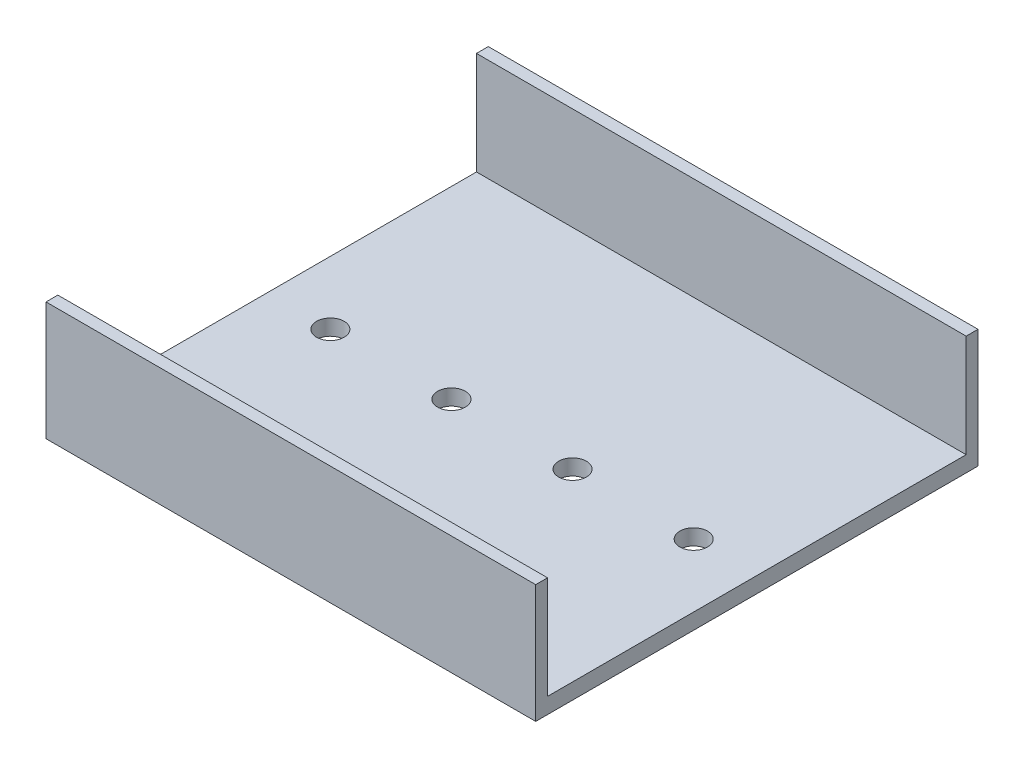
ISO-10303-21;
HEADER;
FILE_DESCRIPTION(('STEP AP214'),'2;1');
FILE_NAME('part.step','',(''),(''),'','','');
FILE_SCHEMA(('AUTOMOTIVE_DESIGN { 1 0 10303 214 1 1 1 1 }'));
ENDSEC;
DATA;
#1=APPLICATION_CONTEXT('core data for automotive mechanical design processes');
#2=APPLICATION_PROTOCOL_DEFINITION('international standard','automotive_design',2000,#1);
#3=PRODUCT_CONTEXT('',#1,'mechanical');
#4=PRODUCT('Part','Part','',(#3));
#5=PRODUCT_RELATED_PRODUCT_CATEGORY('part','',(#4));
#6=PRODUCT_DEFINITION_FORMATION('','',#4);
#7=PRODUCT_DEFINITION_CONTEXT('part definition',#1,'design');
#8=PRODUCT_DEFINITION('design','',#6,#7);
#9=PRODUCT_DEFINITION_SHAPE('','',#8);
#10=(LENGTH_UNIT() NAMED_UNIT(*) SI_UNIT(.MILLI.,.METRE.));
#11=(NAMED_UNIT(*) PLANE_ANGLE_UNIT() SI_UNIT($,.RADIAN.));
#12=(NAMED_UNIT(*) SI_UNIT($,.STERADIAN.) SOLID_ANGLE_UNIT());
#13=UNCERTAINTY_MEASURE_WITH_UNIT(LENGTH_MEASURE(1.E-05),#10,'distance_accuracy_value','');
#14=(GEOMETRIC_REPRESENTATION_CONTEXT(3) GLOBAL_UNCERTAINTY_ASSIGNED_CONTEXT((#13)) GLOBAL_UNIT_ASSIGNED_CONTEXT((#10,
#11,#12)) REPRESENTATION_CONTEXT('',''));
#15=CARTESIAN_POINT('',(0.,0.,0.));
#16=DIRECTION('',(0.,0.,1.));
#17=DIRECTION('',(1.,0.,0.));
#18=AXIS2_PLACEMENT_3D('',#15,#16,#17);
#19=CARTESIAN_POINT('',(0.,15.,0.));
#20=DIRECTION('',(0.,-1.,0.));
#21=DIRECTION('',(0.,0.,-1.));
#22=AXIS2_PLACEMENT_3D('',#19,#20,#21);
#23=PLANE('',#22);
#24=DIRECTION('',(0.,0.,-1.));
#25=VECTOR('',#24,1.);
#26=CARTESIAN_POINT('',(62.,15.,0.));
#27=LINE('',#26,#25);
#28=CARTESIAN_POINT('',(62.,15.,0.));
#29=VERTEX_POINT('',#28);
#30=CARTESIAN_POINT('',(62.,15.,-1.5));
#31=VERTEX_POINT('',#30);
#32=EDGE_CURVE('E156',#29,#31,#27,.T.);
#33=ORIENTED_EDGE('',*,*,#32,.T.);
#34=DIRECTION('',(1.,0.,0.));
#35=VECTOR('',#34,1.);
#36=CARTESIAN_POINT('',(0.,15.,-1.5));
#37=LINE('',#36,#35);
#38=CARTESIAN_POINT('',(0.,15.,-1.5));
#39=VERTEX_POINT('',#38);
#40=EDGE_CURVE('E121',#39,#31,#37,.T.);
#41=ORIENTED_EDGE('',*,*,#40,.F.);
#42=DIRECTION('',(0.,0.,1.));
#43=VECTOR('',#42,1.);
#44=CARTESIAN_POINT('',(0.,15.,0.));
#45=LINE('',#44,#43);
#46=CARTESIAN_POINT('',(0.,15.,0.));
#47=VERTEX_POINT('',#46);
#48=EDGE_CURVE('E94',#39,#47,#45,.T.);
#49=ORIENTED_EDGE('',*,*,#48,.T.);
#50=DIRECTION('',(1.,0.,0.));
#51=VECTOR('',#50,1.);
#52=CARTESIAN_POINT('',(0.,15.,0.));
#53=LINE('',#52,#51);
#54=EDGE_CURVE('E153',#47,#29,#53,.T.);
#55=ORIENTED_EDGE('',*,*,#54,.T.);
#56=EDGE_LOOP('',(#33,#41,#49,#55));
#57=FACE_BOUND('',#56,.T.);
#58=ADVANCED_FACE('F41',(#57),#23,.F.);
#59=CARTESIAN_POINT('',(0.,15.,0.));
#60=DIRECTION('',(1.,0.,0.));
#61=DIRECTION('',(0.,0.,-1.));
#62=AXIS2_PLACEMENT_3D('',#59,#60,#61);
#63=PLANE('',#62);
#64=ORIENTED_EDGE('',*,*,#48,.F.);
#65=DIRECTION('',(0.,1.,0.));
#66=VECTOR('',#65,1.);
#67=CARTESIAN_POINT('',(0.,-81.5659242576212,-1.5));
#68=LINE('',#67,#66);
#69=CARTESIAN_POINT('',(0.,2.,-1.5));
#70=VERTEX_POINT('',#69);
#71=EDGE_CURVE('E148',#70,#39,#68,.T.);
#72=ORIENTED_EDGE('',*,*,#71,.F.);
#73=DIRECTION('',(0.,0.,1.));
#74=VECTOR('',#73,1.);
#75=CARTESIAN_POINT('',(0.,2.,-54.5));
#76=LINE('',#75,#74);
#77=CARTESIAN_POINT('',(0.,2.,-54.5));
#78=VERTEX_POINT('',#77);
#79=EDGE_CURVE('E133',#78,#70,#76,.T.);
#80=ORIENTED_EDGE('',*,*,#79,.F.);
#81=DIRECTION('',(0.,1.,0.));
#82=VECTOR('',#81,1.);
#83=CARTESIAN_POINT('',(0.,-81.5659242576212,-54.5));
#84=LINE('',#83,#82);
#85=CARTESIAN_POINT('',(0.,15.,-54.5));
#86=VERTEX_POINT('',#85);
#87=EDGE_CURVE('E145',#78,#86,#84,.T.);
#88=ORIENTED_EDGE('',*,*,#87,.T.);
#89=CARTESIAN_POINT('',(0.,15.,-56.));
#90=VERTEX_POINT('',#89);
#91=EDGE_CURVE('E151',#90,#86,#45,.T.);
#92=ORIENTED_EDGE('',*,*,#91,.F.);
#93=DIRECTION('',(0.,-1.,0.));
#94=VECTOR('',#93,1.);
#95=CARTESIAN_POINT('',(0.,15.,-56.));
#96=LINE('',#95,#94);
#97=CARTESIAN_POINT('',(0.,0.,-56.));
#98=VERTEX_POINT('',#97);
#99=EDGE_CURVE('E159',#90,#98,#96,.T.);
#100=ORIENTED_EDGE('',*,*,#99,.T.);
#101=DIRECTION('',(0.,0.,1.));
#102=VECTOR('',#101,1.);
#103=CARTESIAN_POINT('',(0.,0.,0.));
#104=LINE('',#103,#102);
#105=CARTESIAN_POINT('',(0.,0.,0.));
#106=VERTEX_POINT('',#105);
#107=EDGE_CURVE('E150',#98,#106,#104,.T.);
#108=ORIENTED_EDGE('',*,*,#107,.T.);
#109=DIRECTION('',(0.,-1.,0.));
#110=VECTOR('',#109,1.);
#111=CARTESIAN_POINT('',(0.,15.,0.));
#112=LINE('',#111,#110);
#113=EDGE_CURVE('E12',#47,#106,#112,.T.);
#114=ORIENTED_EDGE('',*,*,#113,.F.);
#115=EDGE_LOOP('',(#64,#72,#80,#88,#92,#100,#108,#114));
#116=FACE_BOUND('',#115,.T.);
#117=ADVANCED_FACE('F43',(#116),#63,.F.);
#118=CARTESIAN_POINT('',(0.,15.,0.));
#119=DIRECTION('',(0.,0.,-1.));
#120=DIRECTION('',(-1.,0.,0.));
#121=AXIS2_PLACEMENT_3D('',#118,#119,#120);
#122=PLANE('',#121);
#123=DIRECTION('',(1.,0.,0.));
#124=VECTOR('',#123,1.);
#125=CARTESIAN_POINT('',(0.,0.,0.));
#126=LINE('',#125,#124);
#127=CARTESIAN_POINT('',(62.,0.,0.));
#128=VERTEX_POINT('',#127);
#129=EDGE_CURVE('E162',#106,#128,#126,.T.);
#130=ORIENTED_EDGE('',*,*,#129,.T.);
#131=DIRECTION('',(0.,-1.,0.));
#132=VECTOR('',#131,1.);
#133=CARTESIAN_POINT('',(62.,15.,0.));
#134=LINE('',#133,#132);
#135=EDGE_CURVE('E49',#29,#128,#134,.T.);
#136=ORIENTED_EDGE('',*,*,#135,.F.);
#137=ORIENTED_EDGE('',*,*,#54,.F.);
#138=ORIENTED_EDGE('',*,*,#113,.T.);
#139=EDGE_LOOP('',(#130,#136,#137,#138));
#140=FACE_BOUND('',#139,.T.);
#141=ADVANCED_FACE('F248',(#140),#122,.F.);
#142=CARTESIAN_POINT('',(62.,15.,0.));
#143=DIRECTION('',(-1.,0.,0.));
#144=DIRECTION('',(0.,0.,1.));
#145=AXIS2_PLACEMENT_3D('',#142,#143,#144);
#146=PLANE('',#145);
#147=DIRECTION('',(0.,0.,-1.));
#148=VECTOR('',#147,1.);
#149=CARTESIAN_POINT('',(62.,2.,-54.5));
#150=LINE('',#149,#148);
#151=CARTESIAN_POINT('',(62.,2.,-1.5));
#152=VERTEX_POINT('',#151);
#153=CARTESIAN_POINT('',(62.,2.,-54.5));
#154=VERTEX_POINT('',#153);
#155=EDGE_CURVE('E126',#152,#154,#150,.T.);
#156=ORIENTED_EDGE('',*,*,#155,.F.);
#157=DIRECTION('',(0.,1.,0.));
#158=VECTOR('',#157,1.);
#159=CARTESIAN_POINT('',(62.,-81.5659242576212,-1.5));
#160=LINE('',#159,#158);
#161=EDGE_CURVE('E116',#152,#31,#160,.T.);
#162=ORIENTED_EDGE('',*,*,#161,.T.);
#163=ORIENTED_EDGE('',*,*,#32,.F.);
#164=ORIENTED_EDGE('',*,*,#135,.T.);
#165=DIRECTION('',(0.,0.,-1.));
#166=VECTOR('',#165,1.);
#167=CARTESIAN_POINT('',(62.,0.,0.));
#168=LINE('',#167,#166);
#169=CARTESIAN_POINT('',(62.,0.,-56.));
#170=VERTEX_POINT('',#169);
#171=EDGE_CURVE('E164',#128,#170,#168,.T.);
#172=ORIENTED_EDGE('',*,*,#171,.T.);
#173=DIRECTION('',(0.,-1.,0.));
#174=VECTOR('',#173,1.);
#175=CARTESIAN_POINT('',(62.,15.,-56.));
#176=LINE('',#175,#174);
#177=CARTESIAN_POINT('',(62.,15.,-56.));
#178=VERTEX_POINT('',#177);
#179=EDGE_CURVE('E168',#178,#170,#176,.T.);
#180=ORIENTED_EDGE('',*,*,#179,.F.);
#181=CARTESIAN_POINT('',(62.,15.,-54.5));
#182=VERTEX_POINT('',#181);
#183=EDGE_CURVE('E155',#182,#178,#27,.T.);
#184=ORIENTED_EDGE('',*,*,#183,.F.);
#185=DIRECTION('',(0.,1.,0.));
#186=VECTOR('',#185,1.);
#187=CARTESIAN_POINT('',(62.,-81.5659242576212,-54.5));
#188=LINE('',#187,#186);
#189=EDGE_CURVE('E56',#154,#182,#188,.T.);
#190=ORIENTED_EDGE('',*,*,#189,.F.);
#191=EDGE_LOOP('',(#156,#162,#163,#164,#172,#180,#184,#190));
#192=FACE_BOUND('',#191,.T.);
#193=ADVANCED_FACE('F137',(#192),#146,.F.);
#194=CARTESIAN_POINT('',(0.,15.,-56.));
#195=DIRECTION('',(0.,0.,1.));
#196=DIRECTION('',(1.,0.,0.));
#197=AXIS2_PLACEMENT_3D('',#194,#195,#196);
#198=PLANE('',#197);
#199=DIRECTION('',(-1.,0.,0.));
#200=VECTOR('',#199,1.);
#201=CARTESIAN_POINT('',(0.,0.,-56.));
#202=LINE('',#201,#200);
#203=EDGE_CURVE('E86',#170,#98,#202,.T.);
#204=ORIENTED_EDGE('',*,*,#203,.T.);
#205=ORIENTED_EDGE('',*,*,#99,.F.);
#206=DIRECTION('',(-1.,0.,0.));
#207=VECTOR('',#206,1.);
#208=CARTESIAN_POINT('',(0.,15.,-56.));
#209=LINE('',#208,#207);
#210=EDGE_CURVE('E65',#178,#90,#209,.T.);
#211=ORIENTED_EDGE('',*,*,#210,.F.);
#212=ORIENTED_EDGE('',*,*,#179,.T.);
#213=EDGE_LOOP('',(#204,#205,#211,#212));
#214=FACE_BOUND('',#213,.T.);
#215=ADVANCED_FACE('F180',(#214),#198,.F.);
#216=ORIENTED_EDGE('',*,*,#91,.T.);
#217=DIRECTION('',(-1.,0.,0.));
#218=VECTOR('',#217,1.);
#219=CARTESIAN_POINT('',(0.,15.,-54.5));
#220=LINE('',#219,#218);
#221=EDGE_CURVE('E135',#182,#86,#220,.T.);
#222=ORIENTED_EDGE('',*,*,#221,.F.);
#223=ORIENTED_EDGE('',*,*,#183,.T.);
#224=ORIENTED_EDGE('',*,*,#210,.T.);
#225=EDGE_LOOP('',(#216,#222,#223,#224));
#226=FACE_BOUND('',#225,.T.);
#227=ADVANCED_FACE('F181',(#226),#23,.F.);
#228=CARTESIAN_POINT('',(0.,0.,0.));
#229=DIRECTION('',(0.,-1.,0.));
#230=DIRECTION('',(0.,0.,-1.));
#231=AXIS2_PLACEMENT_3D('',#228,#229,#230);
#232=PLANE('',#231);
#233=CARTESIAN_POINT('',(8.,0.,-28.));
#234=DIRECTION('',(0.,1.,0.));
#235=DIRECTION('',(0.,0.,1.));
#236=AXIS2_PLACEMENT_3D('',#233,#234,#235);
#237=CIRCLE('',#236,1.75);
#238=CARTESIAN_POINT('',(8.,0.,-26.25));
#239=VERTEX_POINT('',#238);
#240=EDGE_CURVE('E183',#239,#239,#237,.T.);
#241=ORIENTED_EDGE('',*,*,#240,.T.);
#242=EDGE_LOOP('',(#241));
#243=FACE_BOUND('',#242,.T.);
#244=CARTESIAN_POINT('',(23.3333333333333,0.,-28.));
#245=DIRECTION('',(0.,1.,0.));
#246=DIRECTION('',(0.,0.,1.));
#247=AXIS2_PLACEMENT_3D('',#244,#245,#246);
#248=CIRCLE('',#247,1.75);
#249=CARTESIAN_POINT('',(23.3333333333333,0.,-26.25));
#250=VERTEX_POINT('',#249);
#251=EDGE_CURVE('E198',#250,#250,#248,.T.);
#252=ORIENTED_EDGE('',*,*,#251,.T.);
#253=EDGE_LOOP('',(#252));
#254=FACE_BOUND('',#253,.T.);
#255=CARTESIAN_POINT('',(38.6666666666667,0.,-28.));
#256=DIRECTION('',(0.,1.,0.));
#257=DIRECTION('',(0.,0.,1.));
#258=AXIS2_PLACEMENT_3D('',#255,#256,#257);
#259=CIRCLE('',#258,1.75);
#260=CARTESIAN_POINT('',(38.6666666666667,0.,-26.25));
#261=VERTEX_POINT('',#260);
#262=EDGE_CURVE('E192',#261,#261,#259,.T.);
#263=ORIENTED_EDGE('',*,*,#262,.T.);
#264=EDGE_LOOP('',(#263));
#265=FACE_BOUND('',#264,.T.);
#266=CARTESIAN_POINT('',(54.,0.,-28.));
#267=DIRECTION('',(0.,1.,0.));
#268=DIRECTION('',(0.,0.,1.));
#269=AXIS2_PLACEMENT_3D('',#266,#267,#268);
#270=CIRCLE('',#269,1.75);
#271=CARTESIAN_POINT('',(54.,0.,-26.25));
#272=VERTEX_POINT('',#271);
#273=EDGE_CURVE('E186',#272,#272,#270,.T.);
#274=ORIENTED_EDGE('',*,*,#273,.T.);
#275=EDGE_LOOP('',(#274));
#276=FACE_BOUND('',#275,.T.);
#277=ORIENTED_EDGE('',*,*,#107,.F.);
#278=ORIENTED_EDGE('',*,*,#203,.F.);
#279=ORIENTED_EDGE('',*,*,#171,.F.);
#280=ORIENTED_EDGE('',*,*,#129,.F.);
#281=EDGE_LOOP('',(#277,#278,#279,#280));
#282=FACE_BOUND('',#281,.T.);
#283=ADVANCED_FACE('F176',(#243,#254,#265,#276,#282),#232,.T.);
#284=CARTESIAN_POINT('',(0.,2.,0.));
#285=DIRECTION('',(0.,-1.,0.));
#286=DIRECTION('',(0.,0.,-1.));
#287=AXIS2_PLACEMENT_3D('',#284,#285,#286);
#288=PLANE('',#287);
#289=CARTESIAN_POINT('',(8.,2.,-28.));
#290=DIRECTION('',(0.,1.,0.));
#291=DIRECTION('',(0.,0.,1.));
#292=AXIS2_PLACEMENT_3D('',#289,#290,#291);
#293=CIRCLE('',#292,1.75);
#294=CARTESIAN_POINT('',(8.,2.,-26.25));
#295=VERTEX_POINT('',#294);
#296=EDGE_CURVE('E204',#295,#295,#293,.T.);
#297=ORIENTED_EDGE('',*,*,#296,.F.);
#298=EDGE_LOOP('',(#297));
#299=FACE_BOUND('',#298,.T.);
#300=CARTESIAN_POINT('',(23.3333333333333,2.,-28.));
#301=DIRECTION('',(0.,1.,0.));
#302=DIRECTION('',(0.,0.,1.));
#303=AXIS2_PLACEMENT_3D('',#300,#301,#302);
#304=CIRCLE('',#303,1.75);
#305=CARTESIAN_POINT('',(23.3333333333333,2.,-26.25));
#306=VERTEX_POINT('',#305);
#307=EDGE_CURVE('E201',#306,#306,#304,.T.);
#308=ORIENTED_EDGE('',*,*,#307,.F.);
#309=EDGE_LOOP('',(#308));
#310=FACE_BOUND('',#309,.T.);
#311=CARTESIAN_POINT('',(38.6666666666667,2.,-28.));
#312=DIRECTION('',(0.,1.,0.));
#313=DIRECTION('',(0.,0.,1.));
#314=AXIS2_PLACEMENT_3D('',#311,#312,#313);
#315=CIRCLE('',#314,1.75);
#316=CARTESIAN_POINT('',(38.6666666666667,2.,-26.25));
#317=VERTEX_POINT('',#316);
#318=EDGE_CURVE('E195',#317,#317,#315,.T.);
#319=ORIENTED_EDGE('',*,*,#318,.F.);
#320=EDGE_LOOP('',(#319));
#321=FACE_BOUND('',#320,.T.);
#322=CARTESIAN_POINT('',(54.,2.,-28.));
#323=DIRECTION('',(0.,1.,0.));
#324=DIRECTION('',(0.,0.,1.));
#325=AXIS2_PLACEMENT_3D('',#322,#323,#324);
#326=CIRCLE('',#325,1.75);
#327=CARTESIAN_POINT('',(54.,2.,-26.25));
#328=VERTEX_POINT('',#327);
#329=EDGE_CURVE('E189',#328,#328,#326,.T.);
#330=ORIENTED_EDGE('',*,*,#329,.F.);
#331=EDGE_LOOP('',(#330));
#332=FACE_BOUND('',#331,.T.);
#333=ORIENTED_EDGE('',*,*,#79,.T.);
#334=DIRECTION('',(1.,0.,0.));
#335=VECTOR('',#334,1.);
#336=CARTESIAN_POINT('',(0.,2.,-1.5));
#337=LINE('',#336,#335);
#338=EDGE_CURVE('E119',#70,#152,#337,.T.);
#339=ORIENTED_EDGE('',*,*,#338,.T.);
#340=ORIENTED_EDGE('',*,*,#155,.T.);
#341=DIRECTION('',(-1.,0.,0.));
#342=VECTOR('',#341,1.);
#343=CARTESIAN_POINT('',(0.,2.,-54.5));
#344=LINE('',#343,#342);
#345=EDGE_CURVE('E140',#154,#78,#344,.T.);
#346=ORIENTED_EDGE('',*,*,#345,.T.);
#347=EDGE_LOOP('',(#333,#339,#340,#346));
#348=FACE_BOUND('',#347,.T.);
#349=ADVANCED_FACE('F130',(#299,#310,#321,#332,#348),#288,.F.);
#350=CARTESIAN_POINT('',(0.,-81.5659242576212,-1.5));
#351=DIRECTION('',(0.,0.,1.));
#352=DIRECTION('',(1.,0.,0.));
#353=AXIS2_PLACEMENT_3D('',#350,#351,#352);
#354=PLANE('',#353);
#355=ORIENTED_EDGE('',*,*,#71,.T.);
#356=ORIENTED_EDGE('',*,*,#40,.T.);
#357=ORIENTED_EDGE('',*,*,#161,.F.);
#358=ORIENTED_EDGE('',*,*,#338,.F.);
#359=EDGE_LOOP('',(#355,#356,#357,#358));
#360=FACE_BOUND('',#359,.T.);
#361=ADVANCED_FACE('F118',(#360),#354,.F.);
#362=CARTESIAN_POINT('',(0.,-81.5659242576212,-54.5));
#363=DIRECTION('',(0.,0.,-1.));
#364=DIRECTION('',(-1.,0.,0.));
#365=AXIS2_PLACEMENT_3D('',#362,#363,#364);
#366=PLANE('',#365);
#367=ORIENTED_EDGE('',*,*,#189,.T.);
#368=ORIENTED_EDGE('',*,*,#221,.T.);
#369=ORIENTED_EDGE('',*,*,#87,.F.);
#370=ORIENTED_EDGE('',*,*,#345,.F.);
#371=EDGE_LOOP('',(#367,#368,#369,#370));
#372=FACE_BOUND('',#371,.T.);
#373=ADVANCED_FACE('F231',(#372),#366,.F.);
#374=CARTESIAN_POINT('',(54.,0.,-28.));
#375=DIRECTION('',(0.,1.,0.));
#376=DIRECTION('',(0.,0.,1.));
#377=AXIS2_PLACEMENT_3D('',#374,#375,#376);
#378=CYLINDRICAL_SURFACE('',#377,1.75);
#379=ORIENTED_EDGE('',*,*,#273,.F.);
#380=EDGE_LOOP('',(#379));
#381=FACE_BOUND('',#380,.T.);
#382=ORIENTED_EDGE('',*,*,#329,.T.);
#383=EDGE_LOOP('',(#382));
#384=FACE_BOUND('',#383,.T.);
#385=ADVANCED_FACE('F228',(#381,#384),#378,.F.);
#386=CARTESIAN_POINT('',(38.6666666666667,0.,-28.));
#387=DIRECTION('',(0.,1.,0.));
#388=DIRECTION('',(0.,0.,1.));
#389=AXIS2_PLACEMENT_3D('',#386,#387,#388);
#390=CYLINDRICAL_SURFACE('',#389,1.75);
#391=ORIENTED_EDGE('',*,*,#262,.F.);
#392=EDGE_LOOP('',(#391));
#393=FACE_BOUND('',#392,.T.);
#394=ORIENTED_EDGE('',*,*,#318,.T.);
#395=EDGE_LOOP('',(#394));
#396=FACE_BOUND('',#395,.T.);
#397=ADVANCED_FACE('F230',(#393,#396),#390,.F.);
#398=CARTESIAN_POINT('',(23.3333333333333,0.,-28.));
#399=DIRECTION('',(0.,1.,0.));
#400=DIRECTION('',(0.,0.,1.));
#401=AXIS2_PLACEMENT_3D('',#398,#399,#400);
#402=CYLINDRICAL_SURFACE('',#401,1.75);
#403=ORIENTED_EDGE('',*,*,#251,.F.);
#404=EDGE_LOOP('',(#403));
#405=FACE_BOUND('',#404,.T.);
#406=ORIENTED_EDGE('',*,*,#307,.T.);
#407=EDGE_LOOP('',(#406));
#408=FACE_BOUND('',#407,.T.);
#409=ADVANCED_FACE('F215',(#405,#408),#402,.F.);
#410=CARTESIAN_POINT('',(8.,0.,-28.));
#411=DIRECTION('',(0.,1.,0.));
#412=DIRECTION('',(0.,0.,1.));
#413=AXIS2_PLACEMENT_3D('',#410,#411,#412);
#414=CYLINDRICAL_SURFACE('',#413,1.75);
#415=ORIENTED_EDGE('',*,*,#240,.F.);
#416=EDGE_LOOP('',(#415));
#417=FACE_BOUND('',#416,.T.);
#418=ORIENTED_EDGE('',*,*,#296,.T.);
#419=EDGE_LOOP('',(#418));
#420=FACE_BOUND('',#419,.T.);
#421=ADVANCED_FACE('F212',(#417,#420),#414,.F.);
#422=CLOSED_SHELL('',(#58,#117,#141,#193,#215,#227,#283,#349,#361,#373,#385,#397,#409,#421));
#423=MANIFOLD_SOLID_BREP('B2',#422);
#424=ADVANCED_BREP_SHAPE_REPRESENTATION('',(#18,#423),#14);
#425=SHAPE_DEFINITION_REPRESENTATION(#9,#424);
ENDSEC;
END-ISO-10303-21;
